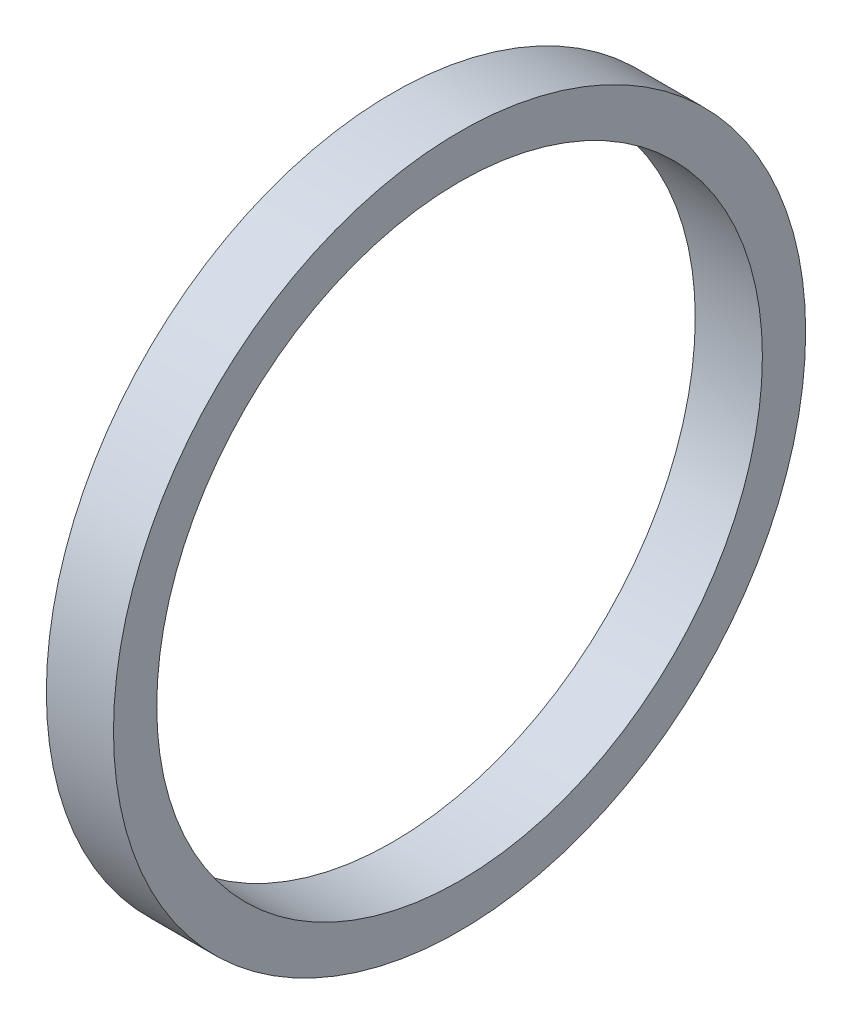
ISO-10303-21;
HEADER;
FILE_DESCRIPTION(('STEP AP214'),'2;1');
FILE_NAME('part.step','',(''),(''),'','','');
FILE_SCHEMA(('AUTOMOTIVE_DESIGN { 1 0 10303 214 1 1 1 1 }'));
ENDSEC;
DATA;
#1=APPLICATION_CONTEXT('core data for automotive mechanical design processes');
#2=APPLICATION_PROTOCOL_DEFINITION('international standard','automotive_design',2000,#1);
#3=PRODUCT_CONTEXT('',#1,'mechanical');
#4=PRODUCT('Part','Part','',(#3));
#5=PRODUCT_RELATED_PRODUCT_CATEGORY('part','',(#4));
#6=PRODUCT_DEFINITION_FORMATION('','',#4);
#7=PRODUCT_DEFINITION_CONTEXT('part definition',#1,'design');
#8=PRODUCT_DEFINITION('design','',#6,#7);
#9=PRODUCT_DEFINITION_SHAPE('','',#8);
#10=(LENGTH_UNIT() NAMED_UNIT(*) SI_UNIT(.MILLI.,.METRE.));
#11=(NAMED_UNIT(*) PLANE_ANGLE_UNIT() SI_UNIT($,.RADIAN.));
#12=(NAMED_UNIT(*) SI_UNIT($,.STERADIAN.) SOLID_ANGLE_UNIT());
#13=UNCERTAINTY_MEASURE_WITH_UNIT(LENGTH_MEASURE(1.E-05),#10,'distance_accuracy_value','');
#14=(GEOMETRIC_REPRESENTATION_CONTEXT(3) GLOBAL_UNCERTAINTY_ASSIGNED_CONTEXT((#13)) GLOBAL_UNIT_ASSIGNED_CONTEXT((#10,
#11,#12)) REPRESENTATION_CONTEXT('',''));
#15=CARTESIAN_POINT('',(0.,0.,0.));
#16=DIRECTION('',(0.,0.,1.));
#17=DIRECTION('',(1.,0.,0.));
#18=AXIS2_PLACEMENT_3D('',#15,#16,#17);
#19=CARTESIAN_POINT('',(2.4638,0.,0.));
#20=DIRECTION('',(1.,0.,0.));
#21=DIRECTION('',(0.,0.,-1.));
#22=AXIS2_PLACEMENT_3D('',#19,#20,#21);
#23=PLANE('',#22);
#24=CARTESIAN_POINT('',(2.4638,0.,0.));
#25=DIRECTION('',(1.,0.,0.));
#26=DIRECTION('',(0.,0.,-1.));
#27=AXIS2_PLACEMENT_3D('',#24,#25,#26);
#28=CIRCLE('',#27,12.7);
#29=CARTESIAN_POINT('',(2.4638,0.,-12.7));
#30=VERTEX_POINT('',#29);
#31=EDGE_CURVE('E10',#30,#30,#28,.T.);
#32=ORIENTED_EDGE('',*,*,#31,.T.);
#33=EDGE_LOOP('',(#32));
#34=FACE_BOUND('',#33,.T.);
#35=CARTESIAN_POINT('',(2.4638,0.,0.));
#36=DIRECTION('',(1.,0.,0.));
#37=DIRECTION('',(0.,0.,-1.));
#38=AXIS2_PLACEMENT_3D('',#35,#36,#37);
#39=CIRCLE('',#38,11.1125);
#40=CARTESIAN_POINT('',(2.4638,0.,-11.1125));
#41=VERTEX_POINT('',#40);
#42=EDGE_CURVE('E41',#41,#41,#39,.T.);
#43=ORIENTED_EDGE('',*,*,#42,.F.);
#44=EDGE_LOOP('',(#43));
#45=FACE_BOUND('',#44,.T.);
#46=ADVANCED_FACE('F30',(#34,#45),#23,.T.);
#47=CARTESIAN_POINT('',(0.,0.,0.));
#48=DIRECTION('',(1.,0.,0.));
#49=DIRECTION('',(0.,0.,-1.));
#50=AXIS2_PLACEMENT_3D('',#47,#48,#49);
#51=PLANE('',#50);
#52=CARTESIAN_POINT('',(0.,0.,0.));
#53=DIRECTION('',(1.,0.,0.));
#54=DIRECTION('',(0.,0.,-1.));
#55=AXIS2_PLACEMENT_3D('',#52,#53,#54);
#56=CIRCLE('',#55,12.7);
#57=CARTESIAN_POINT('',(0.,0.,-12.7));
#58=VERTEX_POINT('',#57);
#59=EDGE_CURVE('E34',#58,#58,#56,.T.);
#60=ORIENTED_EDGE('',*,*,#59,.F.);
#61=EDGE_LOOP('',(#60));
#62=FACE_BOUND('',#61,.T.);
#63=CARTESIAN_POINT('',(0.,0.,0.));
#64=DIRECTION('',(1.,0.,0.));
#65=DIRECTION('',(0.,0.,-1.));
#66=AXIS2_PLACEMENT_3D('',#63,#64,#65);
#67=CIRCLE('',#66,11.1125);
#68=CARTESIAN_POINT('',(0.,0.,-11.1125));
#69=VERTEX_POINT('',#68);
#70=EDGE_CURVE('E43',#69,#69,#67,.T.);
#71=ORIENTED_EDGE('',*,*,#70,.T.);
#72=EDGE_LOOP('',(#71));
#73=FACE_BOUND('',#72,.T.);
#74=ADVANCED_FACE('F53',(#62,#73),#51,.F.);
#75=CARTESIAN_POINT('',(2.4638,0.,0.));
#76=DIRECTION('',(-1.,0.,0.));
#77=DIRECTION('',(0.,0.,1.));
#78=AXIS2_PLACEMENT_3D('',#75,#76,#77);
#79=CYLINDRICAL_SURFACE('',#78,12.7);
#80=ORIENTED_EDGE('',*,*,#31,.F.);
#81=EDGE_LOOP('',(#80));
#82=FACE_BOUND('',#81,.T.);
#83=ORIENTED_EDGE('',*,*,#59,.T.);
#84=EDGE_LOOP('',(#83));
#85=FACE_BOUND('',#84,.T.);
#86=ADVANCED_FACE('F32',(#82,#85),#79,.T.);
#87=CARTESIAN_POINT('',(2.4638,0.,0.));
#88=DIRECTION('',(-1.,0.,0.));
#89=DIRECTION('',(0.,0.,1.));
#90=AXIS2_PLACEMENT_3D('',#87,#88,#89);
#91=CYLINDRICAL_SURFACE('',#90,11.1125);
#92=ORIENTED_EDGE('',*,*,#42,.T.);
#93=EDGE_LOOP('',(#92));
#94=FACE_BOUND('',#93,.T.);
#95=ORIENTED_EDGE('',*,*,#70,.F.);
#96=EDGE_LOOP('',(#95));
#97=FACE_BOUND('',#96,.T.);
#98=ADVANCED_FACE('F49',(#94,#97),#91,.F.);
#99=CLOSED_SHELL('',(#46,#74,#86,#98));
#100=MANIFOLD_SOLID_BREP('B2',#99);
#101=ADVANCED_BREP_SHAPE_REPRESENTATION('',(#18,#100),#14);
#102=SHAPE_DEFINITION_REPRESENTATION(#9,#101);
ENDSEC;
END-ISO-10303-21;
